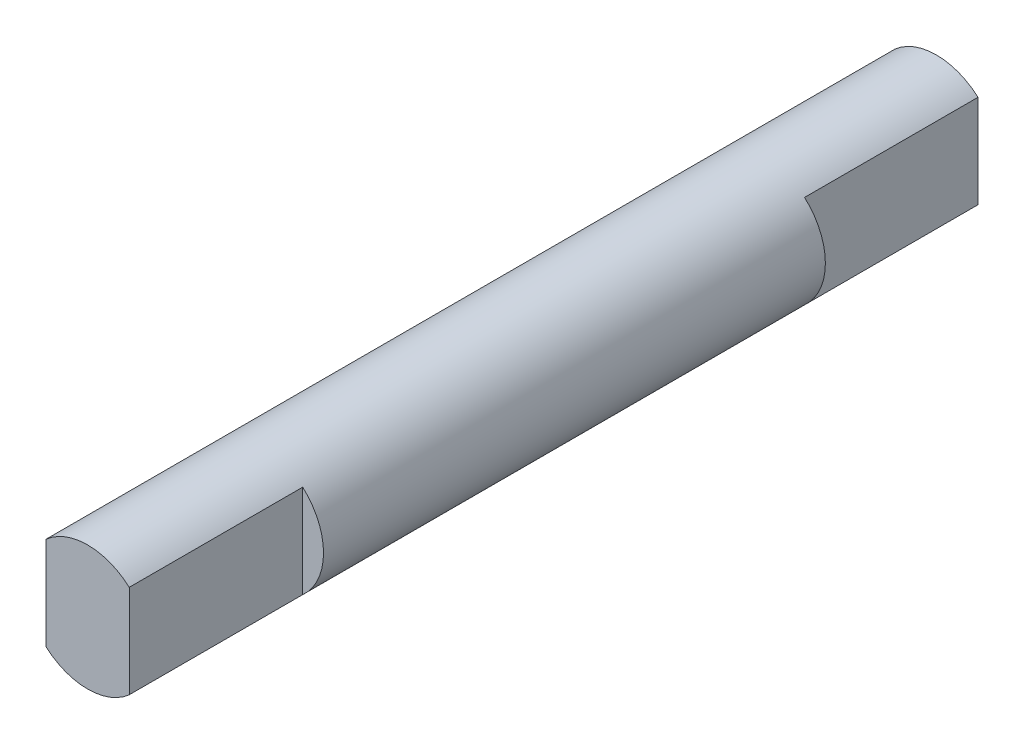
ISO-10303-21;
HEADER;
FILE_DESCRIPTION(('STEP AP214'),'2;1');
FILE_NAME('part.step','',(''),(''),'','','');
FILE_SCHEMA(('AUTOMOTIVE_DESIGN { 1 0 10303 214 1 1 1 1 }'));
ENDSEC;
DATA;
#1=APPLICATION_CONTEXT('core data for automotive mechanical design processes');
#2=APPLICATION_PROTOCOL_DEFINITION('international standard','automotive_design',2000,#1);
#3=PRODUCT_CONTEXT('',#1,'mechanical');
#4=PRODUCT('Part','Part','',(#3));
#5=PRODUCT_RELATED_PRODUCT_CATEGORY('part','',(#4));
#6=PRODUCT_DEFINITION_FORMATION('','',#4);
#7=PRODUCT_DEFINITION_CONTEXT('part definition',#1,'design');
#8=PRODUCT_DEFINITION('design','',#6,#7);
#9=PRODUCT_DEFINITION_SHAPE('','',#8);
#10=(LENGTH_UNIT() NAMED_UNIT(*) SI_UNIT(.MILLI.,.METRE.));
#11=(NAMED_UNIT(*) PLANE_ANGLE_UNIT() SI_UNIT($,.RADIAN.));
#12=(NAMED_UNIT(*) SI_UNIT($,.STERADIAN.) SOLID_ANGLE_UNIT());
#13=UNCERTAINTY_MEASURE_WITH_UNIT(LENGTH_MEASURE(1.E-05),#10,'distance_accuracy_value','');
#14=(GEOMETRIC_REPRESENTATION_CONTEXT(3) GLOBAL_UNCERTAINTY_ASSIGNED_CONTEXT((#13)) GLOBAL_UNIT_ASSIGNED_CONTEXT((#10,
#11,#12)) REPRESENTATION_CONTEXT('',''));
#15=CARTESIAN_POINT('',(0.,0.,0.));
#16=DIRECTION('',(0.,0.,1.));
#17=DIRECTION('',(1.,0.,0.));
#18=AXIS2_PLACEMENT_3D('',#15,#16,#17);
#19=CARTESIAN_POINT('',(0.,0.,36.7));
#20=DIRECTION('',(0.,0.,1.));
#21=DIRECTION('',(1.,0.,0.));
#22=AXIS2_PLACEMENT_3D('',#19,#20,#21);
#23=PLANE('',#22);
#24=CARTESIAN_POINT('',(0.,0.,36.7));
#25=DIRECTION('',(0.,0.,1.));
#26=DIRECTION('',(1.,0.,0.));
#27=AXIS2_PLACEMENT_3D('',#24,#25,#26);
#28=CIRCLE('',#27,2.7);
#29=CARTESIAN_POINT('',(-1.8,-2.01246117974981,36.7));
#30=VERTEX_POINT('',#29);
#31=CARTESIAN_POINT('',(1.8,-2.01246117974981,36.7));
#32=VERTEX_POINT('',#31);
#33=EDGE_CURVE('E48',#30,#32,#28,.T.);
#34=ORIENTED_EDGE('',*,*,#33,.T.);
#35=DIRECTION('',(0.,1.,0.));
#36=VECTOR('',#35,1.);
#37=CARTESIAN_POINT('',(1.8,0.,36.7));
#38=LINE('',#37,#36);
#39=CARTESIAN_POINT('',(1.8,2.01246117974981,36.7));
#40=VERTEX_POINT('',#39);
#41=EDGE_CURVE('E112',#32,#40,#38,.T.);
#42=ORIENTED_EDGE('',*,*,#41,.T.);
#43=CARTESIAN_POINT('',(-1.8,2.01246117974981,36.7));
#44=VERTEX_POINT('',#43);
#45=EDGE_CURVE('E11',#40,#44,#28,.T.);
#46=ORIENTED_EDGE('',*,*,#45,.T.);
#47=DIRECTION('',(0.,1.,0.));
#48=VECTOR('',#47,1.);
#49=CARTESIAN_POINT('',(-1.8,0.,36.7));
#50=LINE('',#49,#48);
#51=EDGE_CURVE('E129',#30,#44,#50,.T.);
#52=ORIENTED_EDGE('',*,*,#51,.F.);
#53=EDGE_LOOP('',(#34,#42,#46,#52));
#54=FACE_BOUND('',#53,.T.);
#55=ADVANCED_FACE('F39',(#54),#23,.T.);
#56=CARTESIAN_POINT('',(0.,0.,0.));
#57=DIRECTION('',(0.,0.,1.));
#58=DIRECTION('',(1.,0.,0.));
#59=AXIS2_PLACEMENT_3D('',#56,#57,#58);
#60=PLANE('',#59);
#61=DIRECTION('',(0.,1.,0.));
#62=VECTOR('',#61,1.);
#63=CARTESIAN_POINT('',(1.8,0.,0.));
#64=LINE('',#63,#62);
#65=CARTESIAN_POINT('',(1.8,-2.01246117974981,0.));
#66=VERTEX_POINT('',#65);
#67=CARTESIAN_POINT('',(1.8,2.01246117974981,0.));
#68=VERTEX_POINT('',#67);
#69=EDGE_CURVE('E136',#66,#68,#64,.T.);
#70=ORIENTED_EDGE('',*,*,#69,.F.);
#71=CARTESIAN_POINT('',(0.,0.,0.));
#72=DIRECTION('',(0.,0.,1.));
#73=DIRECTION('',(1.,0.,0.));
#74=AXIS2_PLACEMENT_3D('',#71,#72,#73);
#75=CIRCLE('',#74,2.7);
#76=CARTESIAN_POINT('',(-1.8,-2.01246117974981,0.));
#77=VERTEX_POINT('',#76);
#78=EDGE_CURVE('E150',#77,#66,#75,.T.);
#79=ORIENTED_EDGE('',*,*,#78,.F.);
#80=DIRECTION('',(0.,1.,0.));
#81=VECTOR('',#80,1.);
#82=CARTESIAN_POINT('',(-1.8,0.,0.));
#83=LINE('',#82,#81);
#84=CARTESIAN_POINT('',(-1.8,2.01246117974981,0.));
#85=VERTEX_POINT('',#84);
#86=EDGE_CURVE('E116',#77,#85,#83,.T.);
#87=ORIENTED_EDGE('',*,*,#86,.T.);
#88=EDGE_CURVE('E43',#68,#85,#75,.T.);
#89=ORIENTED_EDGE('',*,*,#88,.F.);
#90=EDGE_LOOP('',(#70,#79,#87,#89));
#91=FACE_BOUND('',#90,.T.);
#92=ADVANCED_FACE('F167',(#91),#60,.F.);
#93=CARTESIAN_POINT('',(0.,0.,36.7));
#94=DIRECTION('',(0.,0.,-1.));
#95=DIRECTION('',(-1.,0.,0.));
#96=AXIS2_PLACEMENT_3D('',#93,#94,#95);
#97=CYLINDRICAL_SURFACE('',#96,2.7);
#98=CARTESIAN_POINT('',(0.,0.,29.2));
#99=DIRECTION('',(0.,0.,1.));
#100=DIRECTION('',(1.,0.,0.));
#101=AXIS2_PLACEMENT_3D('',#98,#99,#100);
#102=CIRCLE('',#101,2.7);
#103=CARTESIAN_POINT('',(1.8,-2.01246117974981,29.2));
#104=VERTEX_POINT('',#103);
#105=CARTESIAN_POINT('',(1.8,2.01246117974981,29.2));
#106=VERTEX_POINT('',#105);
#107=EDGE_CURVE('E109',#104,#106,#102,.T.);
#108=ORIENTED_EDGE('',*,*,#107,.F.);
#109=DIRECTION('',(0.,0.,1.));
#110=VECTOR('',#109,1.);
#111=CARTESIAN_POINT('',(1.8,-2.01246117974981,29.2));
#112=LINE('',#111,#110);
#113=EDGE_CURVE('E107',#104,#32,#112,.T.);
#114=ORIENTED_EDGE('',*,*,#113,.T.);
#115=ORIENTED_EDGE('',*,*,#33,.F.);
#116=DIRECTION('',(0.,0.,1.));
#117=VECTOR('',#116,1.);
#118=CARTESIAN_POINT('',(-1.8,-2.01246117974981,29.2));
#119=LINE('',#118,#117);
#120=CARTESIAN_POINT('',(-1.8,-2.01246117974981,29.2));
#121=VERTEX_POINT('',#120);
#122=EDGE_CURVE('E132',#121,#30,#119,.T.);
#123=ORIENTED_EDGE('',*,*,#122,.F.);
#124=CARTESIAN_POINT('',(0.,0.,29.2));
#125=DIRECTION('',(0.,0.,1.));
#126=DIRECTION('',(1.,0.,0.));
#127=AXIS2_PLACEMENT_3D('',#124,#125,#126);
#128=CIRCLE('',#127,2.7);
#129=CARTESIAN_POINT('',(-1.8,2.01246117974981,29.2));
#130=VERTEX_POINT('',#129);
#131=EDGE_CURVE('E130',#130,#121,#128,.T.);
#132=ORIENTED_EDGE('',*,*,#131,.F.);
#133=DIRECTION('',(0.,0.,1.));
#134=VECTOR('',#133,1.);
#135=CARTESIAN_POINT('',(-1.8,2.01246117974981,29.2));
#136=LINE('',#135,#134);
#137=EDGE_CURVE('E134',#130,#44,#136,.T.);
#138=ORIENTED_EDGE('',*,*,#137,.T.);
#139=ORIENTED_EDGE('',*,*,#45,.F.);
#140=DIRECTION('',(0.,0.,1.));
#141=VECTOR('',#140,1.);
#142=CARTESIAN_POINT('',(1.8,2.01246117974981,29.2));
#143=LINE('',#142,#141);
#144=EDGE_CURVE('E104',#106,#40,#143,.T.);
#145=ORIENTED_EDGE('',*,*,#144,.F.);
#146=EDGE_LOOP('',(#108,#114,#115,#123,#132,#138,#139,#145));
#147=FACE_BOUND('',#146,.T.);
#148=CARTESIAN_POINT('',(0.,0.,7.5));
#149=DIRECTION('',(0.,0.,-1.));
#150=DIRECTION('',(-1.,0.,0.));
#151=AXIS2_PLACEMENT_3D('',#148,#149,#150);
#152=CIRCLE('',#151,2.7);
#153=CARTESIAN_POINT('',(1.8,2.01246117974981,7.5));
#154=VERTEX_POINT('',#153);
#155=CARTESIAN_POINT('',(1.8,-2.01246117974981,7.5));
#156=VERTEX_POINT('',#155);
#157=EDGE_CURVE('E137',#154,#156,#152,.T.);
#158=ORIENTED_EDGE('',*,*,#157,.F.);
#159=DIRECTION('',(0.,0.,-1.));
#160=VECTOR('',#159,1.);
#161=CARTESIAN_POINT('',(1.8,2.01246117974981,7.5));
#162=LINE('',#161,#160);
#163=EDGE_CURVE('E145',#154,#68,#162,.T.);
#164=ORIENTED_EDGE('',*,*,#163,.T.);
#165=ORIENTED_EDGE('',*,*,#88,.T.);
#166=DIRECTION('',(0.,0.,-1.));
#167=VECTOR('',#166,1.);
#168=CARTESIAN_POINT('',(-1.8,2.01246117974981,7.5));
#169=LINE('',#168,#167);
#170=CARTESIAN_POINT('',(-1.8,2.01246117974981,7.5));
#171=VERTEX_POINT('',#170);
#172=EDGE_CURVE('E141',#171,#85,#169,.T.);
#173=ORIENTED_EDGE('',*,*,#172,.F.);
#174=CARTESIAN_POINT('',(0.,0.,7.5));
#175=DIRECTION('',(0.,0.,-1.));
#176=DIRECTION('',(-1.,0.,0.));
#177=AXIS2_PLACEMENT_3D('',#174,#175,#176);
#178=CIRCLE('',#177,2.7);
#179=CARTESIAN_POINT('',(-1.8,-2.01246117974981,7.5));
#180=VERTEX_POINT('',#179);
#181=EDGE_CURVE('E147',#180,#171,#178,.T.);
#182=ORIENTED_EDGE('',*,*,#181,.F.);
#183=DIRECTION('',(0.,0.,-1.));
#184=VECTOR('',#183,1.);
#185=CARTESIAN_POINT('',(-1.8,-2.01246117974981,7.5));
#186=LINE('',#185,#184);
#187=EDGE_CURVE('E155',#180,#77,#186,.T.);
#188=ORIENTED_EDGE('',*,*,#187,.T.);
#189=ORIENTED_EDGE('',*,*,#78,.T.);
#190=DIRECTION('',(0.,0.,-1.));
#191=VECTOR('',#190,1.);
#192=CARTESIAN_POINT('',(1.8,-2.01246117974981,7.5));
#193=LINE('',#192,#191);
#194=EDGE_CURVE('E143',#156,#66,#193,.T.);
#195=ORIENTED_EDGE('',*,*,#194,.F.);
#196=EDGE_LOOP('',(#158,#164,#165,#173,#182,#188,#189,#195));
#197=FACE_BOUND('',#196,.T.);
#198=ADVANCED_FACE('F41',(#147,#197),#97,.T.);
#199=CARTESIAN_POINT('',(-1.8,0.,7.5));
#200=DIRECTION('',(-1.,0.,0.));
#201=DIRECTION('',(0.,0.,1.));
#202=AXIS2_PLACEMENT_3D('',#199,#200,#201);
#203=PLANE('',#202);
#204=ORIENTED_EDGE('',*,*,#86,.F.);
#205=ORIENTED_EDGE('',*,*,#187,.F.);
#206=DIRECTION('',(0.,1.,0.));
#207=VECTOR('',#206,1.);
#208=CARTESIAN_POINT('',(-1.8,0.,7.5));
#209=LINE('',#208,#207);
#210=EDGE_CURVE('E125',#180,#171,#209,.T.);
#211=ORIENTED_EDGE('',*,*,#210,.T.);
#212=ORIENTED_EDGE('',*,*,#172,.T.);
#213=EDGE_LOOP('',(#204,#205,#211,#212));
#214=FACE_BOUND('',#213,.T.);
#215=ADVANCED_FACE('F198',(#214),#203,.T.);
#216=CARTESIAN_POINT('',(0.,0.,7.5));
#217=DIRECTION('',(0.,0.,-1.));
#218=DIRECTION('',(-1.,0.,0.));
#219=AXIS2_PLACEMENT_3D('',#216,#217,#218);
#220=PLANE('',#219);
#221=ORIENTED_EDGE('',*,*,#210,.F.);
#222=ORIENTED_EDGE('',*,*,#181,.T.);
#223=EDGE_LOOP('',(#221,#222));
#224=FACE_BOUND('',#223,.T.);
#225=ADVANCED_FACE('F200',(#224),#220,.T.);
#226=CARTESIAN_POINT('',(1.8,0.,7.5));
#227=DIRECTION('',(-1.,0.,0.));
#228=DIRECTION('',(0.,0.,1.));
#229=AXIS2_PLACEMENT_3D('',#226,#227,#228);
#230=PLANE('',#229);
#231=ORIENTED_EDGE('',*,*,#69,.T.);
#232=ORIENTED_EDGE('',*,*,#163,.F.);
#233=DIRECTION('',(0.,1.,0.));
#234=VECTOR('',#233,1.);
#235=CARTESIAN_POINT('',(1.8,0.,7.5));
#236=LINE('',#235,#234);
#237=EDGE_CURVE('E139',#156,#154,#236,.T.);
#238=ORIENTED_EDGE('',*,*,#237,.F.);
#239=ORIENTED_EDGE('',*,*,#194,.T.);
#240=EDGE_LOOP('',(#231,#232,#238,#239));
#241=FACE_BOUND('',#240,.T.);
#242=ADVANCED_FACE('F190',(#241),#230,.F.);
#243=CARTESIAN_POINT('',(0.,0.,7.5));
#244=DIRECTION('',(0.,0.,-1.));
#245=DIRECTION('',(-1.,0.,0.));
#246=AXIS2_PLACEMENT_3D('',#243,#244,#245);
#247=PLANE('',#246);
#248=ORIENTED_EDGE('',*,*,#157,.T.);
#249=ORIENTED_EDGE('',*,*,#237,.T.);
#250=EDGE_LOOP('',(#248,#249));
#251=FACE_BOUND('',#250,.T.);
#252=ADVANCED_FACE('F176',(#251),#247,.T.);
#253=CARTESIAN_POINT('',(-1.8,0.,29.2));
#254=DIRECTION('',(1.,0.,0.));
#255=DIRECTION('',(0.,0.,-1.));
#256=AXIS2_PLACEMENT_3D('',#253,#254,#255);
#257=PLANE('',#256);
#258=ORIENTED_EDGE('',*,*,#51,.T.);
#259=ORIENTED_EDGE('',*,*,#137,.F.);
#260=DIRECTION('',(0.,1.,0.));
#261=VECTOR('',#260,1.);
#262=CARTESIAN_POINT('',(-1.8,0.,29.2));
#263=LINE('',#262,#261);
#264=EDGE_CURVE('E62',#121,#130,#263,.T.);
#265=ORIENTED_EDGE('',*,*,#264,.F.);
#266=ORIENTED_EDGE('',*,*,#122,.T.);
#267=EDGE_LOOP('',(#258,#259,#265,#266));
#268=FACE_BOUND('',#267,.T.);
#269=ADVANCED_FACE('F177',(#268),#257,.F.);
#270=CARTESIAN_POINT('',(0.,0.,29.2));
#271=DIRECTION('',(0.,0.,1.));
#272=DIRECTION('',(1.,0.,0.));
#273=AXIS2_PLACEMENT_3D('',#270,#271,#272);
#274=PLANE('',#273);
#275=ORIENTED_EDGE('',*,*,#131,.T.);
#276=ORIENTED_EDGE('',*,*,#264,.T.);
#277=EDGE_LOOP('',(#275,#276));
#278=FACE_BOUND('',#277,.T.);
#279=ADVANCED_FACE('F179',(#278),#274,.T.);
#280=CARTESIAN_POINT('',(1.8,0.,29.2));
#281=DIRECTION('',(1.,0.,0.));
#282=DIRECTION('',(0.,0.,-1.));
#283=AXIS2_PLACEMENT_3D('',#280,#281,#282);
#284=PLANE('',#283);
#285=ORIENTED_EDGE('',*,*,#41,.F.);
#286=ORIENTED_EDGE('',*,*,#113,.F.);
#287=DIRECTION('',(0.,1.,0.));
#288=VECTOR('',#287,1.);
#289=CARTESIAN_POINT('',(1.8,0.,29.2));
#290=LINE('',#289,#288);
#291=EDGE_CURVE('E53',#104,#106,#290,.T.);
#292=ORIENTED_EDGE('',*,*,#291,.T.);
#293=ORIENTED_EDGE('',*,*,#144,.T.);
#294=EDGE_LOOP('',(#285,#286,#292,#293));
#295=FACE_BOUND('',#294,.T.);
#296=ADVANCED_FACE('F103',(#295),#284,.T.);
#297=CARTESIAN_POINT('',(0.,0.,29.2));
#298=DIRECTION('',(0.,0.,1.));
#299=DIRECTION('',(1.,0.,0.));
#300=AXIS2_PLACEMENT_3D('',#297,#298,#299);
#301=PLANE('',#300);
#302=ORIENTED_EDGE('',*,*,#291,.F.);
#303=ORIENTED_EDGE('',*,*,#107,.T.);
#304=EDGE_LOOP('',(#302,#303));
#305=FACE_BOUND('',#304,.T.);
#306=ADVANCED_FACE('F114',(#305),#301,.T.);
#307=CLOSED_SHELL('',(#55,#92,#198,#215,#225,#242,#252,#269,#279,#296,#306));
#308=MANIFOLD_SOLID_BREP('B2',#307);
#309=ADVANCED_BREP_SHAPE_REPRESENTATION('',(#18,#308),#14);
#310=SHAPE_DEFINITION_REPRESENTATION(#9,#309);
ENDSEC;
END-ISO-10303-21;
